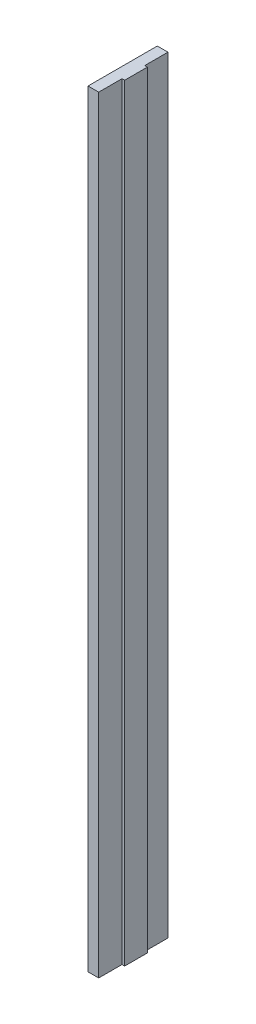
ISO-10303-21;
HEADER;
FILE_DESCRIPTION(('STEP AP214'),'2;1');
FILE_NAME('part.step','',(''),(''),'','','');
FILE_SCHEMA(('AUTOMOTIVE_DESIGN { 1 0 10303 214 1 1 1 1 }'));
ENDSEC;
DATA;
#1=APPLICATION_CONTEXT('core data for automotive mechanical design processes');
#2=APPLICATION_PROTOCOL_DEFINITION('international standard','automotive_design',2000,#1);
#3=PRODUCT_CONTEXT('',#1,'mechanical');
#4=PRODUCT('Part','Part','',(#3));
#5=PRODUCT_RELATED_PRODUCT_CATEGORY('part','',(#4));
#6=PRODUCT_DEFINITION_FORMATION('','',#4);
#7=PRODUCT_DEFINITION_CONTEXT('part definition',#1,'design');
#8=PRODUCT_DEFINITION('design','',#6,#7);
#9=PRODUCT_DEFINITION_SHAPE('','',#8);
#10=(LENGTH_UNIT() NAMED_UNIT(*) SI_UNIT(.MILLI.,.METRE.));
#11=(NAMED_UNIT(*) PLANE_ANGLE_UNIT() SI_UNIT($,.RADIAN.));
#12=(NAMED_UNIT(*) SI_UNIT($,.STERADIAN.) SOLID_ANGLE_UNIT());
#13=UNCERTAINTY_MEASURE_WITH_UNIT(LENGTH_MEASURE(1.E-05),#10,'distance_accuracy_value','');
#14=(GEOMETRIC_REPRESENTATION_CONTEXT(3) GLOBAL_UNCERTAINTY_ASSIGNED_CONTEXT((#13)) GLOBAL_UNIT_ASSIGNED_CONTEXT((#10,
#11,#12)) REPRESENTATION_CONTEXT('',''));
#15=CARTESIAN_POINT('',(0.,0.,0.));
#16=DIRECTION('',(0.,0.,1.));
#17=DIRECTION('',(1.,0.,0.));
#18=AXIS2_PLACEMENT_3D('',#15,#16,#17);
#19=CARTESIAN_POINT('',(15.875,457.2,-41.2749999999999));
#20=DIRECTION('',(0.,0.,1.));
#21=DIRECTION('',(0.,-1.,0.));
#22=AXIS2_PLACEMENT_3D('',#19,#20,#21);
#23=PLANE('',#22);
#24=DIRECTION('',(-1.,0.,0.));
#25=VECTOR('',#24,1.);
#26=CARTESIAN_POINT('',(15.875,457.2,-41.2749999999999));
#27=LINE('',#26,#25);
#28=CARTESIAN_POINT('',(12.7,457.2,-41.2749999999999));
#29=VERTEX_POINT('',#28);
#30=CARTESIAN_POINT('',(0.,457.2,-41.2749999999999));
#31=VERTEX_POINT('',#30);
#32=EDGE_CURVE('E183',#29,#31,#27,.T.);
#33=ORIENTED_EDGE('',*,*,#32,.F.);
#34=DIRECTION('',(0.,1.,0.));
#35=VECTOR('',#34,1.);
#36=CARTESIAN_POINT('',(12.7,-457.2,-41.2749999999999));
#37=LINE('',#36,#35);
#38=CARTESIAN_POINT('',(12.7,-457.2,-41.2749999999999));
#39=VERTEX_POINT('',#38);
#40=EDGE_CURVE('E143',#39,#29,#37,.T.);
#41=ORIENTED_EDGE('',*,*,#40,.F.);
#42=DIRECTION('',(-1.,0.,0.));
#43=VECTOR('',#42,1.);
#44=CARTESIAN_POINT('',(15.875,-457.2,-41.2750000000001));
#45=LINE('',#44,#43);
#46=CARTESIAN_POINT('',(0.,-457.2,-41.2750000000001));
#47=VERTEX_POINT('',#46);
#48=EDGE_CURVE('E124',#39,#47,#45,.T.);
#49=ORIENTED_EDGE('',*,*,#48,.T.);
#50=DIRECTION('',(0.,1.,0.));
#51=VECTOR('',#50,1.);
#52=CARTESIAN_POINT('',(0.,457.2,-41.2749999999999));
#53=LINE('',#52,#51);
#54=EDGE_CURVE('E146',#47,#31,#53,.T.);
#55=ORIENTED_EDGE('',*,*,#54,.T.);
#56=EDGE_LOOP('',(#33,#41,#49,#55));
#57=FACE_BOUND('',#56,.T.);
#58=ADVANCED_FACE('F38',(#57),#23,.F.);
#59=CARTESIAN_POINT('',(15.875,457.2,41.2750000000001));
#60=DIRECTION('',(0.,-1.,0.));
#61=DIRECTION('',(0.,0.,-1.));
#62=AXIS2_PLACEMENT_3D('',#59,#60,#61);
#63=PLANE('',#62);
#64=DIRECTION('',(-1.,0.,0.));
#65=VECTOR('',#64,1.);
#66=CARTESIAN_POINT('',(15.875,457.2,41.2750000000001));
#67=LINE('',#66,#65);
#68=CARTESIAN_POINT('',(12.7,457.2,41.2749999999999));
#69=VERTEX_POINT('',#68);
#70=CARTESIAN_POINT('',(0.,457.2,41.2750000000001));
#71=VERTEX_POINT('',#70);
#72=EDGE_CURVE('E180',#69,#71,#67,.T.);
#73=ORIENTED_EDGE('',*,*,#72,.F.);
#74=DIRECTION('',(0.,0.,1.));
#75=VECTOR('',#74,1.);
#76=CARTESIAN_POINT('',(12.7,457.2,41.2749999999999));
#77=LINE('',#76,#75);
#78=CARTESIAN_POINT('',(12.7,457.2,13.5));
#79=VERTEX_POINT('',#78);
#80=EDGE_CURVE('E126',#79,#69,#77,.T.);
#81=ORIENTED_EDGE('',*,*,#80,.F.);
#82=DIRECTION('',(-1.,0.,0.));
#83=VECTOR('',#82,1.);
#84=CARTESIAN_POINT('',(12.7,457.2,13.5));
#85=LINE('',#84,#83);
#86=CARTESIAN_POINT('',(15.875,457.2,13.5));
#87=VERTEX_POINT('',#86);
#88=EDGE_CURVE('E129',#87,#79,#85,.T.);
#89=ORIENTED_EDGE('',*,*,#88,.F.);
#90=DIRECTION('',(0.,0.,1.));
#91=VECTOR('',#90,1.);
#92=CARTESIAN_POINT('',(15.875,457.2,41.2750000000001));
#93=LINE('',#92,#91);
#94=CARTESIAN_POINT('',(15.875,457.2,-13.5));
#95=VERTEX_POINT('',#94);
#96=EDGE_CURVE('E154',#95,#87,#93,.T.);
#97=ORIENTED_EDGE('',*,*,#96,.F.);
#98=DIRECTION('',(1.,0.,0.));
#99=VECTOR('',#98,1.);
#100=CARTESIAN_POINT('',(12.7,457.2,-13.5));
#101=LINE('',#100,#99);
#102=CARTESIAN_POINT('',(12.7,457.2,-13.5));
#103=VERTEX_POINT('',#102);
#104=EDGE_CURVE('E60',#103,#95,#101,.T.);
#105=ORIENTED_EDGE('',*,*,#104,.F.);
#106=DIRECTION('',(0.,0.,1.));
#107=VECTOR('',#106,1.);
#108=CARTESIAN_POINT('',(12.7,457.2,-41.2749999999999));
#109=LINE('',#108,#107);
#110=EDGE_CURVE('E108',#29,#103,#109,.T.);
#111=ORIENTED_EDGE('',*,*,#110,.F.);
#112=ORIENTED_EDGE('',*,*,#32,.T.);
#113=DIRECTION('',(0.,0.,1.));
#114=VECTOR('',#113,1.);
#115=CARTESIAN_POINT('',(0.,457.2,41.2750000000001));
#116=LINE('',#115,#114);
#117=EDGE_CURVE('E165',#31,#71,#116,.T.);
#118=ORIENTED_EDGE('',*,*,#117,.T.);
#119=EDGE_LOOP('',(#73,#81,#89,#97,#105,#111,#112,#118));
#120=FACE_BOUND('',#119,.T.);
#121=ADVANCED_FACE('F190',(#120),#63,.F.);
#122=CARTESIAN_POINT('',(15.875,457.2,41.2750000000001));
#123=DIRECTION('',(0.,0.,-1.));
#124=DIRECTION('',(0.,1.,0.));
#125=AXIS2_PLACEMENT_3D('',#122,#123,#124);
#126=PLANE('',#125);
#127=DIRECTION('',(-1.,0.,0.));
#128=VECTOR('',#127,1.);
#129=CARTESIAN_POINT('',(15.875,-457.2,41.2749999999999));
#130=LINE('',#129,#128);
#131=CARTESIAN_POINT('',(12.7,-457.2,41.2749999999999));
#132=VERTEX_POINT('',#131);
#133=CARTESIAN_POINT('',(0.,-457.2,41.2749999999999));
#134=VERTEX_POINT('',#133);
#135=EDGE_CURVE('E177',#132,#134,#130,.T.);
#136=ORIENTED_EDGE('',*,*,#135,.F.);
#137=DIRECTION('',(0.,1.,0.));
#138=VECTOR('',#137,1.);
#139=CARTESIAN_POINT('',(12.7,-457.2,41.2749999999999));
#140=LINE('',#139,#138);
#141=EDGE_CURVE('E147',#132,#69,#140,.T.);
#142=ORIENTED_EDGE('',*,*,#141,.T.);
#143=ORIENTED_EDGE('',*,*,#72,.T.);
#144=DIRECTION('',(0.,-1.,0.));
#145=VECTOR('',#144,1.);
#146=CARTESIAN_POINT('',(0.,457.2,41.2750000000001));
#147=LINE('',#146,#145);
#148=EDGE_CURVE('E169',#71,#134,#147,.T.);
#149=ORIENTED_EDGE('',*,*,#148,.T.);
#150=EDGE_LOOP('',(#136,#142,#143,#149));
#151=FACE_BOUND('',#150,.T.);
#152=ADVANCED_FACE('F200',(#151),#126,.F.);
#153=CARTESIAN_POINT('',(15.875,-457.2,41.2749999999999));
#154=DIRECTION('',(0.,1.,0.));
#155=DIRECTION('',(0.,0.,1.));
#156=AXIS2_PLACEMENT_3D('',#153,#154,#155);
#157=PLANE('',#156);
#158=DIRECTION('',(-1.,0.,0.));
#159=VECTOR('',#158,1.);
#160=CARTESIAN_POINT('',(12.7,-457.2,13.5));
#161=LINE('',#160,#159);
#162=CARTESIAN_POINT('',(15.875,-457.2,13.5));
#163=VERTEX_POINT('',#162);
#164=CARTESIAN_POINT('',(12.7,-457.2,13.5));
#165=VERTEX_POINT('',#164);
#166=EDGE_CURVE('E52',#163,#165,#161,.T.);
#167=ORIENTED_EDGE('',*,*,#166,.T.);
#168=DIRECTION('',(0.,0.,1.));
#169=VECTOR('',#168,1.);
#170=CARTESIAN_POINT('',(12.7,-457.2,41.2749999999999));
#171=LINE('',#170,#169);
#172=EDGE_CURVE('E111',#165,#132,#171,.T.);
#173=ORIENTED_EDGE('',*,*,#172,.T.);
#174=ORIENTED_EDGE('',*,*,#135,.T.);
#175=DIRECTION('',(0.,0.,-1.));
#176=VECTOR('',#175,1.);
#177=CARTESIAN_POINT('',(0.,-457.2,41.2749999999999));
#178=LINE('',#177,#176);
#179=EDGE_CURVE('E159',#134,#47,#178,.T.);
#180=ORIENTED_EDGE('',*,*,#179,.T.);
#181=ORIENTED_EDGE('',*,*,#48,.F.);
#182=DIRECTION('',(0.,0.,1.));
#183=VECTOR('',#182,1.);
#184=CARTESIAN_POINT('',(12.7,-457.2,-41.2749999999999));
#185=LINE('',#184,#183);
#186=CARTESIAN_POINT('',(12.7,-457.2,-13.5));
#187=VERTEX_POINT('',#186);
#188=EDGE_CURVE('E105',#39,#187,#185,.T.);
#189=ORIENTED_EDGE('',*,*,#188,.T.);
#190=DIRECTION('',(1.,0.,0.));
#191=VECTOR('',#190,1.);
#192=CARTESIAN_POINT('',(12.7,-457.2,-13.5));
#193=LINE('',#192,#191);
#194=CARTESIAN_POINT('',(15.875,-457.2,-13.5));
#195=VERTEX_POINT('',#194);
#196=EDGE_CURVE('E114',#187,#195,#193,.T.);
#197=ORIENTED_EDGE('',*,*,#196,.T.);
#198=DIRECTION('',(0.,0.,-1.));
#199=VECTOR('',#198,1.);
#200=CARTESIAN_POINT('',(15.875,-457.2,41.2749999999999));
#201=LINE('',#200,#199);
#202=EDGE_CURVE('E158',#163,#195,#201,.T.);
#203=ORIENTED_EDGE('',*,*,#202,.F.);
#204=EDGE_LOOP('',(#167,#173,#174,#180,#181,#189,#197,#203));
#205=FACE_BOUND('',#204,.T.);
#206=ADVANCED_FACE('F122',(#205),#157,.F.);
#207=CARTESIAN_POINT('',(15.875,0.,0.));
#208=DIRECTION('',(1.,0.,0.));
#209=DIRECTION('',(0.,0.,-1.));
#210=AXIS2_PLACEMENT_3D('',#207,#208,#209);
#211=PLANE('',#210);
#212=DIRECTION('',(0.,1.,0.));
#213=VECTOR('',#212,1.);
#214=CARTESIAN_POINT('',(15.875,0.,13.5));
#215=LINE('',#214,#213);
#216=EDGE_CURVE('E11',#163,#87,#215,.T.);
#217=ORIENTED_EDGE('',*,*,#216,.F.);
#218=ORIENTED_EDGE('',*,*,#202,.T.);
#219=DIRECTION('',(0.,-1.,0.));
#220=VECTOR('',#219,1.);
#221=CARTESIAN_POINT('',(15.875,0.,-13.5));
#222=LINE('',#221,#220);
#223=EDGE_CURVE('E46',#95,#195,#222,.T.);
#224=ORIENTED_EDGE('',*,*,#223,.F.);
#225=ORIENTED_EDGE('',*,*,#96,.T.);
#226=EDGE_LOOP('',(#217,#218,#224,#225));
#227=FACE_BOUND('',#226,.T.);
#228=ADVANCED_FACE('F208',(#227),#211,.T.);
#229=CARTESIAN_POINT('',(0.,0.,0.));
#230=DIRECTION('',(1.,0.,0.));
#231=DIRECTION('',(0.,0.,-1.));
#232=AXIS2_PLACEMENT_3D('',#229,#230,#231);
#233=PLANE('',#232);
#234=ORIENTED_EDGE('',*,*,#54,.F.);
#235=ORIENTED_EDGE('',*,*,#179,.F.);
#236=ORIENTED_EDGE('',*,*,#148,.F.);
#237=ORIENTED_EDGE('',*,*,#117,.F.);
#238=EDGE_LOOP('',(#234,#235,#236,#237));
#239=FACE_BOUND('',#238,.T.);
#240=ADVANCED_FACE('F195',(#239),#233,.F.);
#241=CARTESIAN_POINT('',(12.7,-457.2,-13.5));
#242=DIRECTION('',(0.,0.,1.));
#243=DIRECTION('',(1.,0.,0.));
#244=AXIS2_PLACEMENT_3D('',#241,#242,#243);
#245=PLANE('',#244);
#246=ORIENTED_EDGE('',*,*,#223,.T.);
#247=ORIENTED_EDGE('',*,*,#196,.F.);
#248=DIRECTION('',(0.,1.,0.));
#249=VECTOR('',#248,1.);
#250=CARTESIAN_POINT('',(12.7,-457.2,-13.5));
#251=LINE('',#250,#249);
#252=EDGE_CURVE('E101',#187,#103,#251,.T.);
#253=ORIENTED_EDGE('',*,*,#252,.T.);
#254=ORIENTED_EDGE('',*,*,#104,.T.);
#255=EDGE_LOOP('',(#246,#247,#253,#254));
#256=FACE_BOUND('',#255,.T.);
#257=ADVANCED_FACE('F115',(#256),#245,.F.);
#258=CARTESIAN_POINT('',(12.7,-457.2,-41.2749999999999));
#259=DIRECTION('',(-1.,0.,0.));
#260=DIRECTION('',(0.,0.,1.));
#261=AXIS2_PLACEMENT_3D('',#258,#259,#260);
#262=PLANE('',#261);
#263=ORIENTED_EDGE('',*,*,#110,.T.);
#264=ORIENTED_EDGE('',*,*,#252,.F.);
#265=ORIENTED_EDGE('',*,*,#188,.F.);
#266=ORIENTED_EDGE('',*,*,#40,.T.);
#267=EDGE_LOOP('',(#263,#264,#265,#266));
#268=FACE_BOUND('',#267,.T.);
#269=ADVANCED_FACE('F103',(#268),#262,.F.);
#270=CARTESIAN_POINT('',(12.7,-457.2,41.2749999999999));
#271=DIRECTION('',(-1.,0.,0.));
#272=DIRECTION('',(0.,0.,1.));
#273=AXIS2_PLACEMENT_3D('',#270,#271,#272);
#274=PLANE('',#273);
#275=ORIENTED_EDGE('',*,*,#80,.T.);
#276=ORIENTED_EDGE('',*,*,#141,.F.);
#277=ORIENTED_EDGE('',*,*,#172,.F.);
#278=DIRECTION('',(0.,1.,0.));
#279=VECTOR('',#278,1.);
#280=CARTESIAN_POINT('',(12.7,-457.2,13.5));
#281=LINE('',#280,#279);
#282=EDGE_CURVE('E110',#165,#79,#281,.T.);
#283=ORIENTED_EDGE('',*,*,#282,.T.);
#284=EDGE_LOOP('',(#275,#276,#277,#283));
#285=FACE_BOUND('',#284,.T.);
#286=ADVANCED_FACE('F205',(#285),#274,.F.);
#287=CARTESIAN_POINT('',(12.7,-457.2,13.5));
#288=DIRECTION('',(0.,0.,-1.));
#289=DIRECTION('',(-1.,0.,0.));
#290=AXIS2_PLACEMENT_3D('',#287,#288,#289);
#291=PLANE('',#290);
#292=ORIENTED_EDGE('',*,*,#216,.T.);
#293=ORIENTED_EDGE('',*,*,#88,.T.);
#294=ORIENTED_EDGE('',*,*,#282,.F.);
#295=ORIENTED_EDGE('',*,*,#166,.F.);
#296=EDGE_LOOP('',(#292,#293,#294,#295));
#297=FACE_BOUND('',#296,.T.);
#298=ADVANCED_FACE('F206',(#297),#291,.F.);
#299=CLOSED_SHELL('',(#58,#121,#152,#206,#228,#240,#257,#269,#286,#298));
#300=MANIFOLD_SOLID_BREP('B2',#299);
#301=ADVANCED_BREP_SHAPE_REPRESENTATION('',(#18,#300),#14);
#302=SHAPE_DEFINITION_REPRESENTATION(#9,#301);
ENDSEC;
END-ISO-10303-21;
